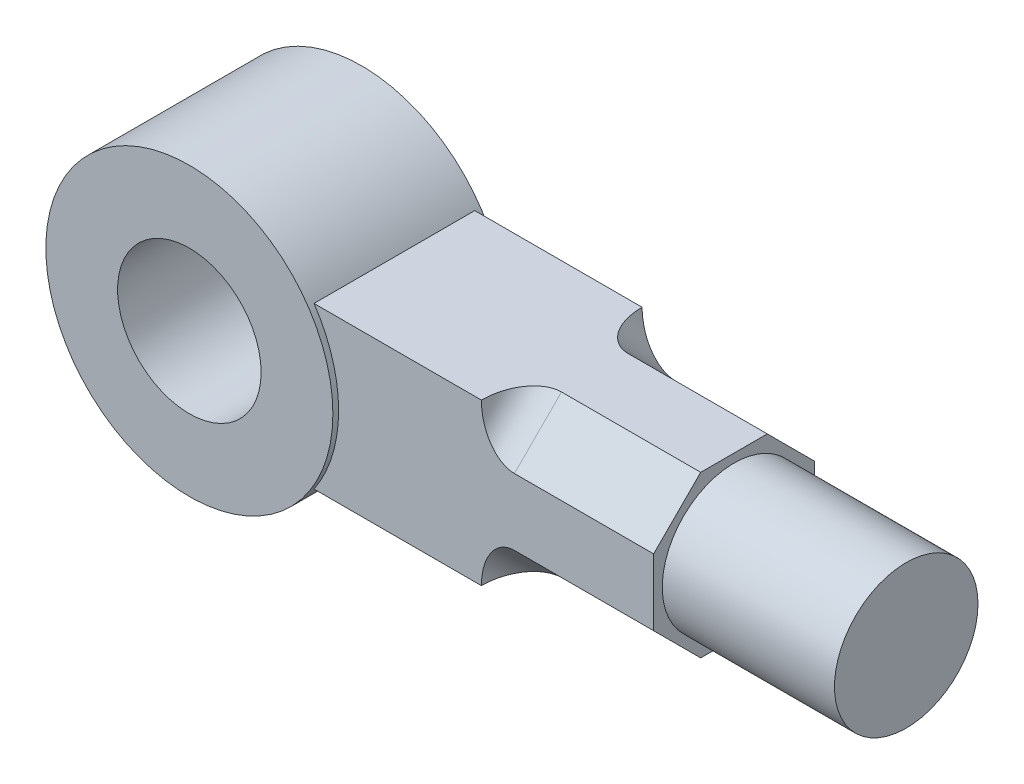
ISO-10303-21;
HEADER;
FILE_DESCRIPTION(('STEP AP214'),'2;1');
FILE_NAME('part.step','',(''),(''),'','','');
FILE_SCHEMA(('AUTOMOTIVE_DESIGN { 1 0 10303 214 1 1 1 1 }'));
ENDSEC;
DATA;
#1=APPLICATION_CONTEXT('core data for automotive mechanical design processes');
#2=APPLICATION_PROTOCOL_DEFINITION('international standard','automotive_design',2000,#1);
#3=PRODUCT_CONTEXT('',#1,'mechanical');
#4=PRODUCT('Part','Part','',(#3));
#5=PRODUCT_RELATED_PRODUCT_CATEGORY('part','',(#4));
#6=PRODUCT_DEFINITION_FORMATION('','',#4);
#7=PRODUCT_DEFINITION_CONTEXT('part definition',#1,'design');
#8=PRODUCT_DEFINITION('design','',#6,#7);
#9=PRODUCT_DEFINITION_SHAPE('','',#8);
#10=(LENGTH_UNIT() NAMED_UNIT(*) SI_UNIT(.MILLI.,.METRE.));
#11=(NAMED_UNIT(*) PLANE_ANGLE_UNIT() SI_UNIT($,.RADIAN.));
#12=(NAMED_UNIT(*) SI_UNIT($,.STERADIAN.) SOLID_ANGLE_UNIT());
#13=UNCERTAINTY_MEASURE_WITH_UNIT(LENGTH_MEASURE(1.E-05),#10,'distance_accuracy_value','');
#14=(GEOMETRIC_REPRESENTATION_CONTEXT(3) GLOBAL_UNCERTAINTY_ASSIGNED_CONTEXT((#13)) GLOBAL_UNIT_ASSIGNED_CONTEXT((#10,
#11,#12)) REPRESENTATION_CONTEXT('',''));
#15=CARTESIAN_POINT('',(0.,0.,0.));
#16=DIRECTION('',(0.,0.,1.));
#17=DIRECTION('',(1.,0.,0.));
#18=AXIS2_PLACEMENT_3D('',#15,#16,#17);
#19=CARTESIAN_POINT('',(55.6201837095728,-6.96535892843431,-5.96535892843431));
#20=DIRECTION('',(0.,0.707106781186547,-0.707106781186548));
#21=DIRECTION('',(0.,0.707106781186548,0.707106781186547));
#22=AXIS2_PLACEMENT_3D('',#19,#20,#21);
#23=CYLINDRICAL_SURFACE('',#22,5.75);
#24=DIRECTION('',(0.,-0.707106781186547,0.707106781186548));
#25=VECTOR('',#24,1.);
#26=CARTESIAN_POINT('',(49.8701837095728,-6.96535892843431,-5.96535892843431));
#27=LINE('',#26,#25);
#28=CARTESIAN_POINT('',(49.8701837095728,-13.9307178568686,0.999999999999997));
#29=VERTEX_POINT('',#28);
#30=CARTESIAN_POINT('',(49.8701837095728,-14.,1.06928214313137));
#31=VERTEX_POINT('',#30);
#32=EDGE_CURVE('E254',#29,#31,#27,.T.);
#33=ORIENTED_EDGE('',*,*,#32,.F.);
#34=CARTESIAN_POINT('',(55.6201837095728,-13.9307178568686,0.999999999999997));
#35=DIRECTION('',(0.,0.,-1.));
#36=DIRECTION('',(0.,1.,0.));
#37=AXIS2_PLACEMENT_3D('',#34,#35,#36);
#38=ELLIPSE('',#37,8.13172798364529,5.75);
#39=CARTESIAN_POINT('',(55.6201837095728,-5.79898987322333,1.));
#40=VERTEX_POINT('',#39);
#41=EDGE_CURVE('E56',#29,#40,#38,.T.);
#42=ORIENTED_EDGE('',*,*,#41,.T.);
#43=DIRECTION('',(0.,-0.707106781186547,0.707106781186548));
#44=VECTOR('',#43,1.);
#45=CARTESIAN_POINT('',(55.6201837095728,-2.89949493661166,-1.89949493661167));
#46=LINE('',#45,#44);
#47=CARTESIAN_POINT('',(55.6201837095728,-14.,9.20101012677667));
#48=VERTEX_POINT('',#47);
#49=EDGE_CURVE('E257',#48,#40,#46,.F.);
#50=ORIENTED_EDGE('',*,*,#49,.F.);
#51=CARTESIAN_POINT('',(55.6201837095728,-14.,1.06928214313138));
#52=DIRECTION('',(0.,-1.,0.));
#53=DIRECTION('',(0.,0.,-1.));
#54=AXIS2_PLACEMENT_3D('',#51,#52,#53);
#55=ELLIPSE('',#54,8.1317279836453,5.75);
#56=EDGE_CURVE('E38',#48,#31,#55,.T.);
#57=ORIENTED_EDGE('',*,*,#56,.T.);
#58=EDGE_LOOP('',(#33,#42,#50,#57));
#59=FACE_BOUND('',#58,.T.);
#60=ADVANCED_FACE('F35',(#59),#23,.F.);
#61=CARTESIAN_POINT('',(55.6201837095728,-20.9653589284343,21.9653589284343));
#62=DIRECTION('',(0.,-0.707106781186547,-0.707106781186548));
#63=DIRECTION('',(0.,0.707106781186548,-0.707106781186547));
#64=AXIS2_PLACEMENT_3D('',#61,#62,#63);
#65=CYLINDRICAL_SURFACE('',#64,5.75);
#66=DIRECTION('',(0.,0.707106781186547,0.707106781186548));
#67=VECTOR('',#66,1.);
#68=CARTESIAN_POINT('',(49.8701837095728,-20.9653589284343,21.9653589284343));
#69=LINE('',#68,#67);
#70=CARTESIAN_POINT('',(49.8701837095728,-14.,28.9307178568686));
#71=VERTEX_POINT('',#70);
#72=CARTESIAN_POINT('',(49.8701837095728,-13.9307178568686,29.));
#73=VERTEX_POINT('',#72);
#74=EDGE_CURVE('E244',#71,#73,#69,.T.);
#75=ORIENTED_EDGE('',*,*,#74,.F.);
#76=CARTESIAN_POINT('',(55.6201837095728,-14.,28.9307178568686));
#77=DIRECTION('',(0.,-1.,0.));
#78=DIRECTION('',(0.,0.,-1.));
#79=AXIS2_PLACEMENT_3D('',#76,#77,#78);
#80=ELLIPSE('',#79,8.1317279836453,5.75);
#81=CARTESIAN_POINT('',(55.6201837095728,-14.,20.7989898732233));
#82=VERTEX_POINT('',#81);
#83=EDGE_CURVE('E250',#71,#82,#80,.T.);
#84=ORIENTED_EDGE('',*,*,#83,.T.);
#85=DIRECTION('',(0.,0.707106781186547,0.707106781186548));
#86=VECTOR('',#85,1.);
#87=CARTESIAN_POINT('',(55.6201837095728,-16.8994949366117,17.8994949366117));
#88=LINE('',#87,#86);
#89=CARTESIAN_POINT('',(55.6201837095728,-5.79898987322334,29.));
#90=VERTEX_POINT('',#89);
#91=EDGE_CURVE('E247',#90,#82,#88,.F.);
#92=ORIENTED_EDGE('',*,*,#91,.F.);
#93=CARTESIAN_POINT('',(55.6201837095728,-13.9307178568686,29.));
#94=DIRECTION('',(0.,0.,-1.));
#95=DIRECTION('',(0.,-1.,0.));
#96=AXIS2_PLACEMENT_3D('',#93,#94,#95);
#97=ELLIPSE('',#96,8.13172798364529,5.75);
#98=EDGE_CURVE('E252',#90,#73,#97,.F.);
#99=ORIENTED_EDGE('',*,*,#98,.T.);
#100=EDGE_LOOP('',(#75,#84,#92,#99));
#101=FACE_BOUND('',#100,.T.);
#102=ADVANCED_FACE('F333',(#101),#65,.F.);
#103=CARTESIAN_POINT('',(55.6201837095728,6.96535892843431,-5.96535892843431));
#104=DIRECTION('',(0.,0.707106781186548,0.707106781186547));
#105=DIRECTION('',(0.,-0.707106781186547,0.707106781186548));
#106=AXIS2_PLACEMENT_3D('',#103,#104,#105);
#107=CYLINDRICAL_SURFACE('',#106,5.75);
#108=DIRECTION('',(0.,-0.707106781186548,-0.707106781186547));
#109=VECTOR('',#108,1.);
#110=CARTESIAN_POINT('',(49.8701837095728,6.96535892843431,-5.96535892843431));
#111=LINE('',#110,#109);
#112=CARTESIAN_POINT('',(49.8701837095728,14.,1.06928214313137));
#113=VERTEX_POINT('',#112);
#114=CARTESIAN_POINT('',(49.8701837095728,13.9307178568686,0.999999999999997));
#115=VERTEX_POINT('',#114);
#116=EDGE_CURVE('E236',#113,#115,#111,.T.);
#117=ORIENTED_EDGE('',*,*,#116,.F.);
#118=CARTESIAN_POINT('',(55.6201837095728,14.,1.06928214313137));
#119=DIRECTION('',(0.,-1.,0.));
#120=DIRECTION('',(0.,0.,1.));
#121=AXIS2_PLACEMENT_3D('',#118,#119,#120);
#122=ELLIPSE('',#121,8.13172798364529,5.75);
#123=CARTESIAN_POINT('',(55.6201837095728,14.,9.20101012677667));
#124=VERTEX_POINT('',#123);
#125=EDGE_CURVE('E240',#113,#124,#122,.F.);
#126=ORIENTED_EDGE('',*,*,#125,.T.);
#127=DIRECTION('',(0.,-0.707106781186548,-0.707106781186547));
#128=VECTOR('',#127,1.);
#129=CARTESIAN_POINT('',(55.6201837095728,2.89949493661166,-1.89949493661167));
#130=LINE('',#129,#128);
#131=CARTESIAN_POINT('',(55.6201837095728,5.79898987322333,1.));
#132=VERTEX_POINT('',#131);
#133=EDGE_CURVE('E173',#132,#124,#130,.F.);
#134=ORIENTED_EDGE('',*,*,#133,.F.);
#135=CARTESIAN_POINT('',(55.6201837095728,13.9307178568686,0.999999999999997));
#136=DIRECTION('',(0.,0.,-1.));
#137=DIRECTION('',(0.,1.,0.));
#138=AXIS2_PLACEMENT_3D('',#135,#136,#137);
#139=ELLIPSE('',#138,8.1317279836453,5.75);
#140=EDGE_CURVE('E242',#132,#115,#139,.T.);
#141=ORIENTED_EDGE('',*,*,#140,.T.);
#142=EDGE_LOOP('',(#117,#126,#134,#141));
#143=FACE_BOUND('',#142,.T.);
#144=ADVANCED_FACE('F337',(#143),#107,.F.);
#145=CARTESIAN_POINT('',(55.6201837095728,20.9653589284343,21.9653589284343));
#146=DIRECTION('',(0.,-0.707106781186548,0.707106781186547));
#147=DIRECTION('',(0.,-0.707106781186547,-0.707106781186548));
#148=AXIS2_PLACEMENT_3D('',#145,#146,#147);
#149=CYLINDRICAL_SURFACE('',#148,5.75);
#150=DIRECTION('',(0.,0.707106781186548,-0.707106781186547));
#151=VECTOR('',#150,1.);
#152=CARTESIAN_POINT('',(49.8701837095728,20.9653589284343,21.9653589284343));
#153=LINE('',#152,#151);
#154=CARTESIAN_POINT('',(49.8701837095728,13.9307178568686,29.));
#155=VERTEX_POINT('',#154);
#156=CARTESIAN_POINT('',(49.8701837095728,14.,28.9307178568686));
#157=VERTEX_POINT('',#156);
#158=EDGE_CURVE('E224',#155,#157,#153,.T.);
#159=ORIENTED_EDGE('',*,*,#158,.F.);
#160=CARTESIAN_POINT('',(55.6201837095728,13.9307178568686,29.));
#161=DIRECTION('',(0.,0.,-1.));
#162=DIRECTION('',(0.,-1.,0.));
#163=AXIS2_PLACEMENT_3D('',#160,#161,#162);
#164=ELLIPSE('',#163,8.1317279836453,5.75);
#165=CARTESIAN_POINT('',(55.6201837095728,5.79898987322332,29.));
#166=VERTEX_POINT('',#165);
#167=EDGE_CURVE('E232',#155,#166,#164,.F.);
#168=ORIENTED_EDGE('',*,*,#167,.T.);
#169=DIRECTION('',(0.,0.707106781186548,-0.707106781186547));
#170=VECTOR('',#169,1.);
#171=CARTESIAN_POINT('',(55.6201837095728,16.8994949366117,17.8994949366117));
#172=LINE('',#171,#170);
#173=CARTESIAN_POINT('',(55.6201837095728,14.,20.7989898732233));
#174=VERTEX_POINT('',#173);
#175=EDGE_CURVE('E229',#174,#166,#172,.F.);
#176=ORIENTED_EDGE('',*,*,#175,.F.);
#177=CARTESIAN_POINT('',(55.6201837095728,14.,28.9307178568686));
#178=DIRECTION('',(0.,-1.,0.));
#179=DIRECTION('',(0.,0.,1.));
#180=AXIS2_PLACEMENT_3D('',#177,#178,#179);
#181=ELLIPSE('',#180,8.13172798364529,5.75);
#182=EDGE_CURVE('E234',#174,#157,#181,.F.);
#183=ORIENTED_EDGE('',*,*,#182,.T.);
#184=EDGE_LOOP('',(#159,#168,#176,#183));
#185=FACE_BOUND('',#184,.T.);
#186=ADVANCED_FACE('F300',(#185),#149,.F.);
#187=CARTESIAN_POINT('',(49.8701837095728,0.,0.999999999999997));
#188=DIRECTION('',(-1.,0.,0.));
#189=DIRECTION('',(0.,0.,1.));
#190=AXIS2_PLACEMENT_3D('',#187,#188,#189);
#191=PLANE('',#190);
#192=DIRECTION('',(0.,0.,1.));
#193=VECTOR('',#192,1.);
#194=CARTESIAN_POINT('',(49.8701837095728,14.,0.999999999999997));
#195=LINE('',#194,#193);
#196=CARTESIAN_POINT('',(49.8701837095728,14.,0.999999999999997));
#197=VERTEX_POINT('',#196);
#198=EDGE_CURVE('E208',#197,#113,#195,.T.);
#199=ORIENTED_EDGE('',*,*,#198,.T.);
#200=ORIENTED_EDGE('',*,*,#116,.T.);
#201=DIRECTION('',(0.,-1.,0.));
#202=VECTOR('',#201,1.);
#203=CARTESIAN_POINT('',(49.8701837095728,0.,0.999999999999997));
#204=LINE('',#203,#202);
#205=EDGE_CURVE('E189',#197,#115,#204,.T.);
#206=ORIENTED_EDGE('',*,*,#205,.F.);
#207=EDGE_LOOP('',(#199,#200,#206));
#208=FACE_BOUND('',#207,.T.);
#209=ADVANCED_FACE('F347',(#208),#191,.F.);
#210=CARTESIAN_POINT('',(49.8701837095728,-14.,0.999999999999997));
#211=VERTEX_POINT('',#210);
#212=EDGE_CURVE('E188',#29,#211,#204,.T.);
#213=ORIENTED_EDGE('',*,*,#212,.F.);
#214=ORIENTED_EDGE('',*,*,#32,.T.);
#215=DIRECTION('',(0.,0.,1.));
#216=VECTOR('',#215,1.);
#217=CARTESIAN_POINT('',(49.8701837095728,-14.,0.999999999999997));
#218=LINE('',#217,#216);
#219=EDGE_CURVE('E205',#211,#31,#218,.T.);
#220=ORIENTED_EDGE('',*,*,#219,.F.);
#221=EDGE_LOOP('',(#213,#214,#220));
#222=FACE_BOUND('',#221,.T.);
#223=ADVANCED_FACE('F262',(#222),#191,.F.);
#224=CARTESIAN_POINT('',(49.8701837095728,-14.,29.));
#225=VERTEX_POINT('',#224);
#226=EDGE_CURVE('E204',#71,#225,#218,.T.);
#227=ORIENTED_EDGE('',*,*,#226,.F.);
#228=ORIENTED_EDGE('',*,*,#74,.T.);
#229=DIRECTION('',(0.,-1.,0.));
#230=VECTOR('',#229,1.);
#231=CARTESIAN_POINT('',(49.8701837095728,0.,29.));
#232=LINE('',#231,#230);
#233=EDGE_CURVE('E197',#73,#225,#232,.T.);
#234=ORIENTED_EDGE('',*,*,#233,.T.);
#235=EDGE_LOOP('',(#227,#228,#234));
#236=FACE_BOUND('',#235,.T.);
#237=ADVANCED_FACE('F353',(#236),#191,.F.);
#238=CARTESIAN_POINT('',(49.8701837095728,14.,29.));
#239=VERTEX_POINT('',#238);
#240=EDGE_CURVE('E198',#239,#155,#232,.T.);
#241=ORIENTED_EDGE('',*,*,#240,.T.);
#242=ORIENTED_EDGE('',*,*,#158,.T.);
#243=EDGE_CURVE('E207',#157,#239,#195,.T.);
#244=ORIENTED_EDGE('',*,*,#243,.T.);
#245=EDGE_LOOP('',(#241,#242,#244));
#246=FACE_BOUND('',#245,.T.);
#247=ADVANCED_FACE('F303',(#246),#191,.F.);
#248=CARTESIAN_POINT('',(0.,0.,30.));
#249=DIRECTION('',(0.,0.,1.));
#250=DIRECTION('',(1.,0.,0.));
#251=AXIS2_PLACEMENT_3D('',#248,#249,#250);
#252=PLANE('',#251);
#253=CARTESIAN_POINT('',(0.,0.,30.));
#254=DIRECTION('',(0.,0.,1.));
#255=DIRECTION('',(1.,0.,0.));
#256=AXIS2_PLACEMENT_3D('',#253,#254,#255);
#257=CIRCLE('',#256,25.);
#258=CARTESIAN_POINT('',(25.,0.,30.));
#259=VERTEX_POINT('',#258);
#260=EDGE_CURVE('E221',#259,#259,#257,.T.);
#261=ORIENTED_EDGE('',*,*,#260,.T.);
#262=EDGE_LOOP('',(#261));
#263=FACE_BOUND('',#262,.T.);
#264=CARTESIAN_POINT('',(0.,0.,30.));
#265=DIRECTION('',(0.,0.,1.));
#266=DIRECTION('',(1.,0.,0.));
#267=AXIS2_PLACEMENT_3D('',#264,#265,#266);
#268=CIRCLE('',#267,12.5);
#269=CARTESIAN_POINT('',(12.5,0.,30.));
#270=VERTEX_POINT('',#269);
#271=EDGE_CURVE('E215',#270,#270,#268,.T.);
#272=ORIENTED_EDGE('',*,*,#271,.F.);
#273=EDGE_LOOP('',(#272));
#274=FACE_BOUND('',#273,.T.);
#275=ADVANCED_FACE('F320',(#263,#274),#252,.T.);
#276=CARTESIAN_POINT('',(0.,0.,0.));
#277=DIRECTION('',(0.,0.,1.));
#278=DIRECTION('',(1.,0.,0.));
#279=AXIS2_PLACEMENT_3D('',#276,#277,#278);
#280=PLANE('',#279);
#281=CARTESIAN_POINT('',(0.,0.,0.));
#282=DIRECTION('',(0.,0.,1.));
#283=DIRECTION('',(1.,0.,0.));
#284=AXIS2_PLACEMENT_3D('',#281,#282,#283);
#285=CIRCLE('',#284,25.);
#286=CARTESIAN_POINT('',(25.,0.,0.));
#287=VERTEX_POINT('',#286);
#288=EDGE_CURVE('E218',#287,#287,#285,.T.);
#289=ORIENTED_EDGE('',*,*,#288,.F.);
#290=EDGE_LOOP('',(#289));
#291=FACE_BOUND('',#290,.T.);
#292=CARTESIAN_POINT('',(0.,0.,0.));
#293=DIRECTION('',(0.,0.,1.));
#294=DIRECTION('',(1.,0.,0.));
#295=AXIS2_PLACEMENT_3D('',#292,#293,#294);
#296=CIRCLE('',#295,12.5);
#297=CARTESIAN_POINT('',(12.5,0.,0.));
#298=VERTEX_POINT('',#297);
#299=EDGE_CURVE('E214',#298,#298,#296,.T.);
#300=ORIENTED_EDGE('',*,*,#299,.T.);
#301=EDGE_LOOP('',(#300));
#302=FACE_BOUND('',#301,.T.);
#303=ADVANCED_FACE('F312',(#291,#302),#280,.F.);
#304=CARTESIAN_POINT('',(0.,0.,30.));
#305=DIRECTION('',(0.,0.,-1.));
#306=DIRECTION('',(-1.,0.,0.));
#307=AXIS2_PLACEMENT_3D('',#304,#305,#306);
#308=CYLINDRICAL_SURFACE('',#307,25.);
#309=DIRECTION('',(0.,0.,1.));
#310=VECTOR('',#309,1.);
#311=CARTESIAN_POINT('',(20.712315177208,14.,0.999999999999997));
#312=LINE('',#311,#310);
#313=CARTESIAN_POINT('',(20.712315177208,14.,0.999999999999997));
#314=VERTEX_POINT('',#313);
#315=CARTESIAN_POINT('',(20.712315177208,14.,29.));
#316=VERTEX_POINT('',#315);
#317=EDGE_CURVE('E211',#314,#316,#312,.T.);
#318=ORIENTED_EDGE('',*,*,#317,.F.);
#319=CARTESIAN_POINT('',(0.,0.,0.999999999999997));
#320=DIRECTION('',(0.,0.,-1.));
#321=DIRECTION('',(-1.,0.,0.));
#322=AXIS2_PLACEMENT_3D('',#319,#320,#321);
#323=CIRCLE('',#322,25.);
#324=CARTESIAN_POINT('',(20.712315177208,-14.,0.999999999999997));
#325=VERTEX_POINT('',#324);
#326=EDGE_CURVE('E183',#314,#325,#323,.T.);
#327=ORIENTED_EDGE('',*,*,#326,.T.);
#328=DIRECTION('',(0.,0.,1.));
#329=VECTOR('',#328,1.);
#330=CARTESIAN_POINT('',(20.712315177208,-14.,0.999999999999997));
#331=LINE('',#330,#329);
#332=CARTESIAN_POINT('',(20.712315177208,-14.,29.));
#333=VERTEX_POINT('',#332);
#334=EDGE_CURVE('E194',#325,#333,#331,.T.);
#335=ORIENTED_EDGE('',*,*,#334,.T.);
#336=CARTESIAN_POINT('',(0.,0.,29.));
#337=DIRECTION('',(0.,0.,-1.));
#338=DIRECTION('',(-1.,0.,0.));
#339=AXIS2_PLACEMENT_3D('',#336,#337,#338);
#340=CIRCLE('',#339,25.);
#341=EDGE_CURVE('E174',#316,#333,#340,.T.);
#342=ORIENTED_EDGE('',*,*,#341,.F.);
#343=EDGE_LOOP('',(#318,#327,#335,#342));
#344=FACE_BOUND('',#343,.T.);
#345=ORIENTED_EDGE('',*,*,#260,.F.);
#346=EDGE_LOOP('',(#345));
#347=FACE_BOUND('',#346,.T.);
#348=ORIENTED_EDGE('',*,*,#288,.T.);
#349=EDGE_LOOP('',(#348));
#350=FACE_BOUND('',#349,.T.);
#351=ADVANCED_FACE('F308',(#344,#347,#350),#308,.T.);
#352=CARTESIAN_POINT('',(0.,0.,30.));
#353=DIRECTION('',(0.,0.,-1.));
#354=DIRECTION('',(-1.,0.,0.));
#355=AXIS2_PLACEMENT_3D('',#352,#353,#354);
#356=CYLINDRICAL_SURFACE('',#355,12.5);
#357=ORIENTED_EDGE('',*,*,#271,.T.);
#358=EDGE_LOOP('',(#357));
#359=FACE_BOUND('',#358,.T.);
#360=ORIENTED_EDGE('',*,*,#299,.F.);
#361=EDGE_LOOP('',(#360));
#362=FACE_BOUND('',#361,.T.);
#363=ADVANCED_FACE('F311',(#359,#362),#356,.F.);
#364=CARTESIAN_POINT('',(0.,14.,0.999999999999997));
#365=DIRECTION('',(0.,-1.,0.));
#366=DIRECTION('',(1.,0.,0.));
#367=AXIS2_PLACEMENT_3D('',#364,#365,#366);
#368=PLANE('',#367);
#369=DIRECTION('',(1.,0.,0.));
#370=VECTOR('',#369,1.);
#371=CARTESIAN_POINT('',(0.,14.,29.));
#372=LINE('',#371,#370);
#373=EDGE_CURVE('E177',#316,#239,#372,.T.);
#374=ORIENTED_EDGE('',*,*,#373,.T.);
#375=ORIENTED_EDGE('',*,*,#243,.F.);
#376=ORIENTED_EDGE('',*,*,#182,.F.);
#377=DIRECTION('',(-1.,0.,0.));
#378=VECTOR('',#377,1.);
#379=CARTESIAN_POINT('',(79.8701837095728,14.,20.7989898732233));
#380=LINE('',#379,#378);
#381=CARTESIAN_POINT('',(79.8701837095728,14.,20.7989898732233));
#382=VERTEX_POINT('',#381);
#383=EDGE_CURVE('E155',#382,#174,#380,.T.);
#384=ORIENTED_EDGE('',*,*,#383,.F.);
#385=DIRECTION('',(0.,0.,1.));
#386=VECTOR('',#385,1.);
#387=CARTESIAN_POINT('',(79.8701837095728,14.,9.20101012677667));
#388=LINE('',#387,#386);
#389=CARTESIAN_POINT('',(79.8701837095728,14.,9.20101012677667));
#390=VERTEX_POINT('',#389);
#391=EDGE_CURVE('E148',#390,#382,#388,.T.);
#392=ORIENTED_EDGE('',*,*,#391,.F.);
#393=DIRECTION('',(-1.,0.,0.));
#394=VECTOR('',#393,1.);
#395=CARTESIAN_POINT('',(79.8701837095728,14.,9.20101012677667));
#396=LINE('',#395,#394);
#397=EDGE_CURVE('E153',#390,#124,#396,.T.);
#398=ORIENTED_EDGE('',*,*,#397,.T.);
#399=ORIENTED_EDGE('',*,*,#125,.F.);
#400=ORIENTED_EDGE('',*,*,#198,.F.);
#401=DIRECTION('',(1.,0.,0.));
#402=VECTOR('',#401,1.);
#403=CARTESIAN_POINT('',(0.,14.,0.999999999999997));
#404=LINE('',#403,#402);
#405=EDGE_CURVE('E185',#314,#197,#404,.T.);
#406=ORIENTED_EDGE('',*,*,#405,.F.);
#407=ORIENTED_EDGE('',*,*,#317,.T.);
#408=EDGE_LOOP('',(#374,#375,#376,#384,#392,#398,#399,#400,#406,#407));
#409=FACE_BOUND('',#408,.T.);
#410=ADVANCED_FACE('F151',(#409),#368,.F.);
#411=CARTESIAN_POINT('',(0.,-14.,0.999999999999997));
#412=DIRECTION('',(0.,-1.,0.));
#413=DIRECTION('',(1.,0.,0.));
#414=AXIS2_PLACEMENT_3D('',#411,#412,#413);
#415=PLANE('',#414);
#416=ORIENTED_EDGE('',*,*,#83,.F.);
#417=ORIENTED_EDGE('',*,*,#226,.T.);
#418=DIRECTION('',(1.,0.,0.));
#419=VECTOR('',#418,1.);
#420=CARTESIAN_POINT('',(0.,-14.,29.));
#421=LINE('',#420,#419);
#422=EDGE_CURVE('E186',#333,#225,#421,.T.);
#423=ORIENTED_EDGE('',*,*,#422,.F.);
#424=ORIENTED_EDGE('',*,*,#334,.F.);
#425=DIRECTION('',(1.,0.,0.));
#426=VECTOR('',#425,1.);
#427=CARTESIAN_POINT('',(0.,-14.,0.999999999999997));
#428=LINE('',#427,#426);
#429=EDGE_CURVE('E192',#325,#211,#428,.T.);
#430=ORIENTED_EDGE('',*,*,#429,.T.);
#431=ORIENTED_EDGE('',*,*,#219,.T.);
#432=ORIENTED_EDGE('',*,*,#56,.F.);
#433=DIRECTION('',(-1.,0.,0.));
#434=VECTOR('',#433,1.);
#435=CARTESIAN_POINT('',(79.8701837095728,-14.,9.20101012677667));
#436=LINE('',#435,#434);
#437=CARTESIAN_POINT('',(79.8701837095728,-14.,9.20101012677667));
#438=VERTEX_POINT('',#437);
#439=EDGE_CURVE('E275',#438,#48,#436,.T.);
#440=ORIENTED_EDGE('',*,*,#439,.F.);
#441=DIRECTION('',(0.,0.,-1.));
#442=VECTOR('',#441,1.);
#443=CARTESIAN_POINT('',(79.8701837095728,-14.,20.7989898732233));
#444=LINE('',#443,#442);
#445=CARTESIAN_POINT('',(79.8701837095728,-14.,20.7989898732233));
#446=VERTEX_POINT('',#445);
#447=EDGE_CURVE('E536',#446,#438,#444,.T.);
#448=ORIENTED_EDGE('',*,*,#447,.F.);
#449=DIRECTION('',(-1.,0.,0.));
#450=VECTOR('',#449,1.);
#451=CARTESIAN_POINT('',(79.8701837095728,-14.,20.7989898732233));
#452=LINE('',#451,#450);
#453=EDGE_CURVE('E278',#446,#82,#452,.T.);
#454=ORIENTED_EDGE('',*,*,#453,.T.);
#455=EDGE_LOOP('',(#416,#417,#423,#424,#430,#431,#432,#440,#448,#454));
#456=FACE_BOUND('',#455,.T.);
#457=ADVANCED_FACE('F263',(#456),#415,.T.);
#458=CARTESIAN_POINT('',(0.,0.,0.999999999999997));
#459=DIRECTION('',(0.,0.,-1.));
#460=DIRECTION('',(-1.,0.,0.));
#461=AXIS2_PLACEMENT_3D('',#458,#459,#460);
#462=PLANE('',#461);
#463=ORIENTED_EDGE('',*,*,#41,.F.);
#464=ORIENTED_EDGE('',*,*,#212,.T.);
#465=ORIENTED_EDGE('',*,*,#429,.F.);
#466=ORIENTED_EDGE('',*,*,#326,.F.);
#467=ORIENTED_EDGE('',*,*,#405,.T.);
#468=ORIENTED_EDGE('',*,*,#205,.T.);
#469=ORIENTED_EDGE('',*,*,#140,.F.);
#470=DIRECTION('',(-1.,0.,0.));
#471=VECTOR('',#470,1.);
#472=CARTESIAN_POINT('',(79.8701837095728,5.79898987322333,1.));
#473=LINE('',#472,#471);
#474=CARTESIAN_POINT('',(79.8701837095728,5.79898987322333,1.));
#475=VERTEX_POINT('',#474);
#476=EDGE_CURVE('E276',#475,#132,#473,.T.);
#477=ORIENTED_EDGE('',*,*,#476,.F.);
#478=DIRECTION('',(0.,1.,0.));
#479=VECTOR('',#478,1.);
#480=CARTESIAN_POINT('',(79.8701837095728,-5.79898987322333,1.));
#481=LINE('',#480,#479);
#482=CARTESIAN_POINT('',(79.8701837095728,-5.79898987322333,1.));
#483=VERTEX_POINT('',#482);
#484=EDGE_CURVE('E164',#483,#475,#481,.T.);
#485=ORIENTED_EDGE('',*,*,#484,.F.);
#486=DIRECTION('',(-1.,0.,0.));
#487=VECTOR('',#486,1.);
#488=CARTESIAN_POINT('',(79.8701837095728,-5.79898987322333,1.));
#489=LINE('',#488,#487);
#490=EDGE_CURVE('E272',#483,#40,#489,.T.);
#491=ORIENTED_EDGE('',*,*,#490,.T.);
#492=EDGE_LOOP('',(#463,#464,#465,#466,#467,#468,#469,#477,#485,#491));
#493=FACE_BOUND('',#492,.T.);
#494=ADVANCED_FACE('F269',(#493),#462,.T.);
#495=CARTESIAN_POINT('',(0.,0.,29.));
#496=DIRECTION('',(0.,0.,-1.));
#497=DIRECTION('',(-1.,0.,0.));
#498=AXIS2_PLACEMENT_3D('',#495,#496,#497);
#499=PLANE('',#498);
#500=ORIENTED_EDGE('',*,*,#341,.T.);
#501=ORIENTED_EDGE('',*,*,#422,.T.);
#502=ORIENTED_EDGE('',*,*,#233,.F.);
#503=ORIENTED_EDGE('',*,*,#98,.F.);
#504=DIRECTION('',(-1.,0.,0.));
#505=VECTOR('',#504,1.);
#506=CARTESIAN_POINT('',(79.8701837095728,-5.79898987322334,29.));
#507=LINE('',#506,#505);
#508=CARTESIAN_POINT('',(79.8701837095728,-5.79898987322334,29.));
#509=VERTEX_POINT('',#508);
#510=EDGE_CURVE('E285',#509,#90,#507,.T.);
#511=ORIENTED_EDGE('',*,*,#510,.F.);
#512=DIRECTION('',(0.,-1.,0.));
#513=VECTOR('',#512,1.);
#514=CARTESIAN_POINT('',(79.8701837095728,5.79898987322332,29.));
#515=LINE('',#514,#513);
#516=CARTESIAN_POINT('',(79.8701837095728,5.79898987322332,29.));
#517=VERTEX_POINT('',#516);
#518=EDGE_CURVE('E295',#517,#509,#515,.T.);
#519=ORIENTED_EDGE('',*,*,#518,.F.);
#520=DIRECTION('',(-1.,0.,0.));
#521=VECTOR('',#520,1.);
#522=CARTESIAN_POINT('',(79.8701837095728,5.79898987322332,29.));
#523=LINE('',#522,#521);
#524=EDGE_CURVE('E179',#517,#166,#523,.T.);
#525=ORIENTED_EDGE('',*,*,#524,.T.);
#526=ORIENTED_EDGE('',*,*,#167,.F.);
#527=ORIENTED_EDGE('',*,*,#240,.F.);
#528=ORIENTED_EDGE('',*,*,#373,.F.);
#529=EDGE_LOOP('',(#500,#501,#502,#503,#511,#519,#525,#526,#527,#528));
#530=FACE_BOUND('',#529,.T.);
#531=ADVANCED_FACE('F291',(#530),#499,.F.);
#532=CARTESIAN_POINT('',(79.8701837095728,5.79898987322333,1.));
#533=DIRECTION('',(0.,-0.707106781186547,0.707106781186548));
#534=DIRECTION('',(0.,-0.707106781186548,-0.707106781186547));
#535=AXIS2_PLACEMENT_3D('',#532,#533,#534);
#536=PLANE('',#535);
#537=ORIENTED_EDGE('',*,*,#476,.T.);
#538=ORIENTED_EDGE('',*,*,#133,.T.);
#539=ORIENTED_EDGE('',*,*,#397,.F.);
#540=DIRECTION('',(0.,0.707106781186548,0.707106781186547));
#541=VECTOR('',#540,1.);
#542=CARTESIAN_POINT('',(79.8701837095728,5.79898987322333,1.));
#543=LINE('',#542,#541);
#544=EDGE_CURVE('E159',#475,#390,#543,.T.);
#545=ORIENTED_EDGE('',*,*,#544,.F.);
#546=EDGE_LOOP('',(#537,#538,#539,#545));
#547=FACE_BOUND('',#546,.T.);
#548=ADVANCED_FACE('F171',(#547),#536,.F.);
#549=CARTESIAN_POINT('',(79.8701837095728,14.,20.7989898732233));
#550=DIRECTION('',(0.,-0.707106781186547,-0.707106781186548));
#551=DIRECTION('',(0.,0.707106781186548,-0.707106781186547));
#552=AXIS2_PLACEMENT_3D('',#549,#550,#551);
#553=PLANE('',#552);
#554=ORIENTED_EDGE('',*,*,#383,.T.);
#555=ORIENTED_EDGE('',*,*,#175,.T.);
#556=ORIENTED_EDGE('',*,*,#524,.F.);
#557=DIRECTION('',(0.,-0.707106781186548,0.707106781186547));
#558=VECTOR('',#557,1.);
#559=CARTESIAN_POINT('',(79.8701837095728,14.,20.7989898732233));
#560=LINE('',#559,#558);
#561=EDGE_CURVE('E158',#382,#517,#560,.T.);
#562=ORIENTED_EDGE('',*,*,#561,.F.);
#563=EDGE_LOOP('',(#554,#555,#556,#562));
#564=FACE_BOUND('',#563,.T.);
#565=ADVANCED_FACE('F297',(#564),#553,.F.);
#566=CARTESIAN_POINT('',(79.8701837095728,-5.79898987322334,29.));
#567=DIRECTION('',(0.,0.707106781186548,-0.707106781186547));
#568=DIRECTION('',(0.,0.707106781186547,0.707106781186548));
#569=AXIS2_PLACEMENT_3D('',#566,#567,#568);
#570=PLANE('',#569);
#571=ORIENTED_EDGE('',*,*,#510,.T.);
#572=ORIENTED_EDGE('',*,*,#91,.T.);
#573=ORIENTED_EDGE('',*,*,#453,.F.);
#574=DIRECTION('',(0.,-0.707106781186547,-0.707106781186548));
#575=VECTOR('',#574,1.);
#576=CARTESIAN_POINT('',(79.8701837095728,-5.79898987322334,29.));
#577=LINE('',#576,#575);
#578=EDGE_CURVE('E538',#509,#446,#577,.T.);
#579=ORIENTED_EDGE('',*,*,#578,.F.);
#580=EDGE_LOOP('',(#571,#572,#573,#579));
#581=FACE_BOUND('',#580,.T.);
#582=ADVANCED_FACE('F398',(#581),#570,.F.);
#583=CARTESIAN_POINT('',(79.8701837095728,-14.,9.20101012677667));
#584=DIRECTION('',(0.,0.707106781186548,0.707106781186547));
#585=DIRECTION('',(0.,-0.707106781186547,0.707106781186548));
#586=AXIS2_PLACEMENT_3D('',#583,#584,#585);
#587=PLANE('',#586);
#588=ORIENTED_EDGE('',*,*,#439,.T.);
#589=ORIENTED_EDGE('',*,*,#49,.T.);
#590=ORIENTED_EDGE('',*,*,#490,.F.);
#591=DIRECTION('',(0.,0.707106781186547,-0.707106781186548));
#592=VECTOR('',#591,1.);
#593=CARTESIAN_POINT('',(79.8701837095728,-14.,9.20101012677667));
#594=LINE('',#593,#592);
#595=EDGE_CURVE('E534',#438,#483,#594,.T.);
#596=ORIENTED_EDGE('',*,*,#595,.F.);
#597=EDGE_LOOP('',(#588,#589,#590,#596));
#598=FACE_BOUND('',#597,.T.);
#599=ADVANCED_FACE('F402',(#598),#587,.F.);
#600=CARTESIAN_POINT('',(79.8701837095728,0.,0.));
#601=DIRECTION('',(1.,0.,0.));
#602=DIRECTION('',(0.,0.,-1.));
#603=AXIS2_PLACEMENT_3D('',#600,#601,#602);
#604=PLANE('',#603);
#605=CARTESIAN_POINT('',(79.8701837095728,0.,15.));
#606=DIRECTION('',(1.,0.,0.));
#607=DIRECTION('',(0.,0.,-1.));
#608=AXIS2_PLACEMENT_3D('',#605,#606,#607);
#609=CIRCLE('',#608,12.5);
#610=CARTESIAN_POINT('',(79.8701837095728,0.,2.5));
#611=VERTEX_POINT('',#610);
#612=EDGE_CURVE('E11',#611,#611,#609,.T.);
#613=ORIENTED_EDGE('',*,*,#612,.F.);
#614=EDGE_LOOP('',(#613));
#615=FACE_BOUND('',#614,.T.);
#616=ORIENTED_EDGE('',*,*,#544,.T.);
#617=ORIENTED_EDGE('',*,*,#391,.T.);
#618=ORIENTED_EDGE('',*,*,#561,.T.);
#619=ORIENTED_EDGE('',*,*,#518,.T.);
#620=ORIENTED_EDGE('',*,*,#578,.T.);
#621=ORIENTED_EDGE('',*,*,#447,.T.);
#622=ORIENTED_EDGE('',*,*,#595,.T.);
#623=ORIENTED_EDGE('',*,*,#484,.T.);
#624=EDGE_LOOP('',(#616,#617,#618,#619,#620,#621,#622,#623));
#625=FACE_BOUND('',#624,.T.);
#626=ADVANCED_FACE('F162',(#615,#625),#604,.T.);
#627=CARTESIAN_POINT('',(109.870183709573,0.,15.));
#628=DIRECTION('',(-1.,0.,0.));
#629=DIRECTION('',(0.,0.,1.));
#630=AXIS2_PLACEMENT_3D('',#627,#628,#629);
#631=CYLINDRICAL_SURFACE('',#630,12.5);
#632=CARTESIAN_POINT('',(109.870183709573,0.,15.));
#633=DIRECTION('',(1.,0.,0.));
#634=DIRECTION('',(0.,0.,-1.));
#635=AXIS2_PLACEMENT_3D('',#632,#633,#634);
#636=CIRCLE('',#635,12.5);
#637=CARTESIAN_POINT('',(109.870183709573,0.,2.5));
#638=VERTEX_POINT('',#637);
#639=EDGE_CURVE('E168',#638,#638,#636,.T.);
#640=ORIENTED_EDGE('',*,*,#639,.F.);
#641=EDGE_LOOP('',(#640));
#642=FACE_BOUND('',#641,.T.);
#643=ORIENTED_EDGE('',*,*,#612,.T.);
#644=EDGE_LOOP('',(#643));
#645=FACE_BOUND('',#644,.T.);
#646=ADVANCED_FACE('F420',(#642,#645),#631,.T.);
#647=CARTESIAN_POINT('',(109.870183709573,0.,15.));
#648=DIRECTION('',(1.,0.,0.));
#649=DIRECTION('',(0.,0.,-1.));
#650=AXIS2_PLACEMENT_3D('',#647,#648,#649);
#651=PLANE('',#650);
#652=ORIENTED_EDGE('',*,*,#639,.T.);
#653=EDGE_LOOP('',(#652));
#654=FACE_BOUND('',#653,.T.);
#655=ADVANCED_FACE('F426',(#654),#651,.T.);
#656=CLOSED_SHELL('',(#60,#102,#144,#186,#209,#223,#237,#247,#275,#303,#351,#363,#410,#457,#494,
#531,#548,#565,#582,#599,#626,#646,#655));
#657=MANIFOLD_SOLID_BREP('B2',#656);
#658=ADVANCED_BREP_SHAPE_REPRESENTATION('',(#18,#657),#14);
#659=SHAPE_DEFINITION_REPRESENTATION(#9,#658);
ENDSEC;
END-ISO-10303-21;
